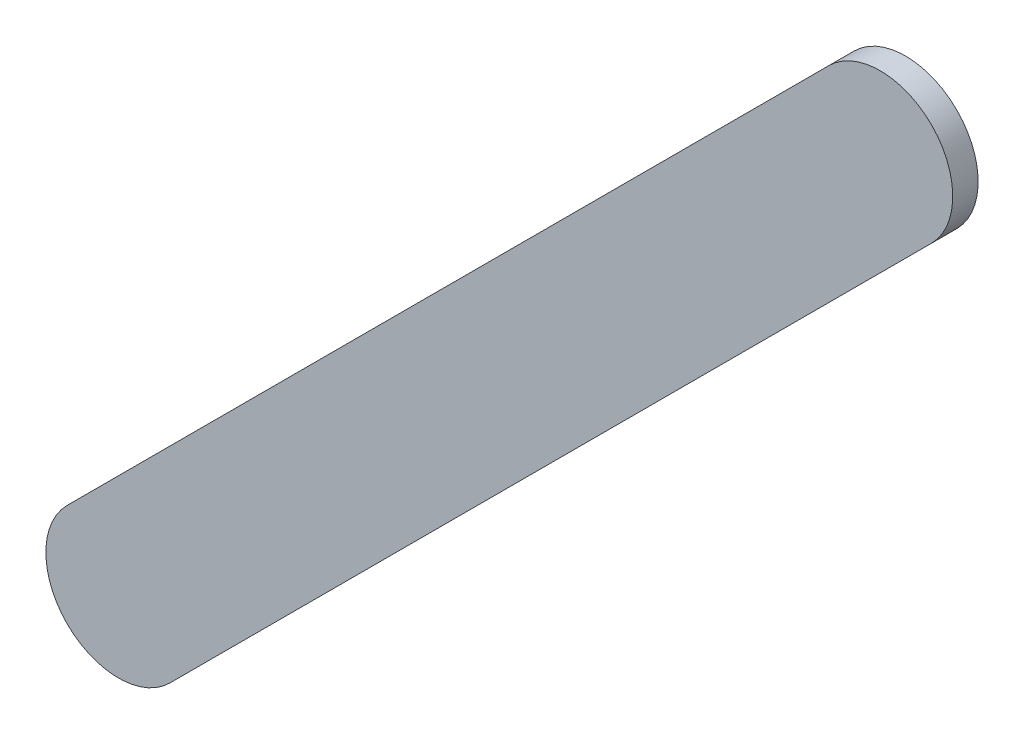
ISO-10303-21;
HEADER;
FILE_DESCRIPTION(('STEP AP214'),'2;1');
FILE_NAME('part.step','',(''),(''),'','','');
FILE_SCHEMA(('AUTOMOTIVE_DESIGN { 1 0 10303 214 1 1 1 1 }'));
ENDSEC;
DATA;
#1=APPLICATION_CONTEXT('core data for automotive mechanical design processes');
#2=APPLICATION_PROTOCOL_DEFINITION('international standard','automotive_design',2000,#1);
#3=PRODUCT_CONTEXT('',#1,'mechanical');
#4=PRODUCT('Part','Part','',(#3));
#5=PRODUCT_RELATED_PRODUCT_CATEGORY('part','',(#4));
#6=PRODUCT_DEFINITION_FORMATION('','',#4);
#7=PRODUCT_DEFINITION_CONTEXT('part definition',#1,'design');
#8=PRODUCT_DEFINITION('design','',#6,#7);
#9=PRODUCT_DEFINITION_SHAPE('','',#8);
#10=(LENGTH_UNIT() NAMED_UNIT(*) SI_UNIT(.MILLI.,.METRE.));
#11=(NAMED_UNIT(*) PLANE_ANGLE_UNIT() SI_UNIT($,.RADIAN.));
#12=(NAMED_UNIT(*) SI_UNIT($,.STERADIAN.) SOLID_ANGLE_UNIT());
#13=UNCERTAINTY_MEASURE_WITH_UNIT(LENGTH_MEASURE(1.E-05),#10,'distance_accuracy_value','');
#14=(GEOMETRIC_REPRESENTATION_CONTEXT(3) GLOBAL_UNCERTAINTY_ASSIGNED_CONTEXT((#13)) GLOBAL_UNIT_ASSIGNED_CONTEXT((#10,
#11,#12)) REPRESENTATION_CONTEXT('',''));
#15=CARTESIAN_POINT('',(0.,0.,0.));
#16=DIRECTION('',(0.,0.,1.));
#17=DIRECTION('',(1.,0.,0.));
#18=AXIS2_PLACEMENT_3D('',#15,#16,#17);
#19=CARTESIAN_POINT('',(76.67071,-135.52071,1.635));
#20=DIRECTION('',(0.,0.,1.));
#21=DIRECTION('',(1.,0.,0.));
#22=AXIS2_PLACEMENT_3D('',#19,#20,#21);
#23=PLANE('',#22);
#24=DIRECTION('',(0.707106781186548,0.707106781186548,0.));
#25=VECTOR('',#24,1.);
#26=CARTESIAN_POINT('',(76.67071,-135.52071,1.635));
#27=LINE('',#26,#25);
#28=CARTESIAN_POINT('',(76.67071,-135.52071,1.635));
#29=VERTEX_POINT('',#28);
#30=CARTESIAN_POINT('',(77.72071,-134.47071,1.635));
#31=VERTEX_POINT('',#30);
#32=EDGE_CURVE('E82',#29,#31,#27,.T.);
#33=ORIENTED_EDGE('',*,*,#32,.T.);
#34=CARTESIAN_POINT('',(77.6499995,-134.3999995,1.635));
#35=DIRECTION('',(0.,0.,1.));
#36=DIRECTION('',(0.707106781186048,-0.707106781187048,0.));
#37=AXIS2_PLACEMENT_3D('',#34,#35,#36);
#38=CIRCLE('',#37,0.09999974810218);
#39=CARTESIAN_POINT('',(77.579289,-134.329289,1.635));
#40=VERTEX_POINT('',#39);
#41=EDGE_CURVE('E104',#31,#40,#38,.T.);
#42=ORIENTED_EDGE('',*,*,#41,.T.);
#43=DIRECTION('',(-0.707106781186548,-0.707106781186548,0.));
#44=VECTOR('',#43,1.);
#45=CARTESIAN_POINT('',(77.579289,-134.329289,1.635));
#46=LINE('',#45,#44);
#47=CARTESIAN_POINT('',(76.529289,-135.379289,1.635));
#48=VERTEX_POINT('',#47);
#49=EDGE_CURVE('E75',#40,#48,#46,.T.);
#50=ORIENTED_EDGE('',*,*,#49,.T.);
#51=CARTESIAN_POINT('',(76.5999995,-135.4499995,1.635));
#52=DIRECTION('',(0.,0.,1.));
#53=DIRECTION('',(-0.707106781186548,0.707106781186548,0.));
#54=AXIS2_PLACEMENT_3D('',#51,#52,#53);
#55=CIRCLE('',#54,0.09999974810219);
#56=EDGE_CURVE('E11',#48,#29,#55,.T.);
#57=ORIENTED_EDGE('',*,*,#56,.T.);
#58=EDGE_LOOP('',(#33,#42,#50,#57));
#59=FACE_BOUND('',#58,.T.);
#60=ADVANCED_FACE('F17',(#59),#23,.T.);
#61=CARTESIAN_POINT('',(76.67071,-135.52071,1.6));
#62=DIRECTION('',(0.,0.,1.));
#63=DIRECTION('',(1.,0.,0.));
#64=AXIS2_PLACEMENT_3D('',#61,#62,#63);
#65=PLANE('',#64);
#66=CARTESIAN_POINT('',(76.5999995,-135.4499995,1.6));
#67=DIRECTION('',(0.,0.,1.));
#68=DIRECTION('',(-0.707106781186548,0.707106781186548,0.));
#69=AXIS2_PLACEMENT_3D('',#66,#67,#68);
#70=CIRCLE('',#69,0.09999974810219);
#71=CARTESIAN_POINT('',(76.529289,-135.379289,1.6));
#72=VERTEX_POINT('',#71);
#73=CARTESIAN_POINT('',(76.67071,-135.52071,1.6));
#74=VERTEX_POINT('',#73);
#75=EDGE_CURVE('E21',#72,#74,#70,.T.);
#76=ORIENTED_EDGE('',*,*,#75,.F.);
#77=DIRECTION('',(-0.707106781186548,-0.707106781186548,0.));
#78=VECTOR('',#77,1.);
#79=CARTESIAN_POINT('',(77.579289,-134.329289,1.6));
#80=LINE('',#79,#78);
#81=CARTESIAN_POINT('',(77.579289,-134.329289,1.6));
#82=VERTEX_POINT('',#81);
#83=EDGE_CURVE('E108',#82,#72,#80,.T.);
#84=ORIENTED_EDGE('',*,*,#83,.F.);
#85=CARTESIAN_POINT('',(77.6499995,-134.3999995,1.6));
#86=DIRECTION('',(0.,0.,1.));
#87=DIRECTION('',(0.707106781186048,-0.707106781187048,0.));
#88=AXIS2_PLACEMENT_3D('',#85,#86,#87);
#89=CIRCLE('',#88,0.09999974810218);
#90=CARTESIAN_POINT('',(77.72071,-134.47071,1.6));
#91=VERTEX_POINT('',#90);
#92=EDGE_CURVE('E84',#91,#82,#89,.T.);
#93=ORIENTED_EDGE('',*,*,#92,.F.);
#94=DIRECTION('',(0.707106781186548,0.707106781186548,0.));
#95=VECTOR('',#94,1.);
#96=CARTESIAN_POINT('',(76.67071,-135.52071,1.6));
#97=LINE('',#96,#95);
#98=EDGE_CURVE('E80',#74,#91,#97,.T.);
#99=ORIENTED_EDGE('',*,*,#98,.F.);
#100=EDGE_LOOP('',(#76,#84,#93,#99));
#101=FACE_BOUND('',#100,.T.);
#102=ADVANCED_FACE('F19',(#101),#65,.F.);
#103=CARTESIAN_POINT('',(76.5999995,-135.4499995,1.6));
#104=DIRECTION('',(0.,0.,-1.));
#105=DIRECTION('',(-0.707106781186548,0.707106781186548,0.));
#106=AXIS2_PLACEMENT_3D('',#103,#104,#105);
#107=CYLINDRICAL_SURFACE('',#106,0.09999974810219);
#108=ORIENTED_EDGE('',*,*,#75,.T.);
#109=DIRECTION('',(0.,0.,1.));
#110=VECTOR('',#109,1.);
#111=CARTESIAN_POINT('',(76.67071,-135.52071,1.6));
#112=LINE('',#111,#110);
#113=EDGE_CURVE('E69',#74,#29,#112,.T.);
#114=ORIENTED_EDGE('',*,*,#113,.T.);
#115=ORIENTED_EDGE('',*,*,#56,.F.);
#116=DIRECTION('',(0.,0.,1.));
#117=VECTOR('',#116,1.);
#118=CARTESIAN_POINT('',(76.529289,-135.379289,1.6));
#119=LINE('',#118,#117);
#120=EDGE_CURVE('E72',#72,#48,#119,.T.);
#121=ORIENTED_EDGE('',*,*,#120,.F.);
#122=EDGE_LOOP('',(#108,#114,#115,#121));
#123=FACE_BOUND('',#122,.T.);
#124=ADVANCED_FACE('F68',(#123),#107,.T.);
#125=CARTESIAN_POINT('',(77.579289,-134.329289,1.6));
#126=DIRECTION('',(0.707106781186548,-0.707106781186548,0.));
#127=DIRECTION('',(0.,0.,-1.));
#128=AXIS2_PLACEMENT_3D('',#125,#126,#127);
#129=PLANE('',#128);
#130=ORIENTED_EDGE('',*,*,#83,.T.);
#131=ORIENTED_EDGE('',*,*,#120,.T.);
#132=ORIENTED_EDGE('',*,*,#49,.F.);
#133=DIRECTION('',(0.,0.,1.));
#134=VECTOR('',#133,1.);
#135=CARTESIAN_POINT('',(77.579289,-134.329289,1.6));
#136=LINE('',#135,#134);
#137=EDGE_CURVE('E100',#82,#40,#136,.T.);
#138=ORIENTED_EDGE('',*,*,#137,.F.);
#139=EDGE_LOOP('',(#130,#131,#132,#138));
#140=FACE_BOUND('',#139,.T.);
#141=ADVANCED_FACE('F119',(#140),#129,.F.);
#142=CARTESIAN_POINT('',(77.6499995,-134.3999995,1.6));
#143=DIRECTION('',(0.,0.,-1.));
#144=DIRECTION('',(0.707106781186048,-0.707106781187048,0.));
#145=AXIS2_PLACEMENT_3D('',#142,#143,#144);
#146=CYLINDRICAL_SURFACE('',#145,0.09999974810218);
#147=ORIENTED_EDGE('',*,*,#92,.T.);
#148=ORIENTED_EDGE('',*,*,#137,.T.);
#149=ORIENTED_EDGE('',*,*,#41,.F.);
#150=DIRECTION('',(0.,0.,1.));
#151=VECTOR('',#150,1.);
#152=CARTESIAN_POINT('',(77.72071,-134.47071,1.6));
#153=LINE('',#152,#151);
#154=EDGE_CURVE('E89',#91,#31,#153,.T.);
#155=ORIENTED_EDGE('',*,*,#154,.F.);
#156=EDGE_LOOP('',(#147,#148,#149,#155));
#157=FACE_BOUND('',#156,.T.);
#158=ADVANCED_FACE('F121',(#157),#146,.T.);
#159=CARTESIAN_POINT('',(76.67071,-135.52071,1.6));
#160=DIRECTION('',(-0.707106781186548,0.707106781186548,0.));
#161=DIRECTION('',(0.,0.,1.));
#162=AXIS2_PLACEMENT_3D('',#159,#160,#161);
#163=PLANE('',#162);
#164=ORIENTED_EDGE('',*,*,#98,.T.);
#165=ORIENTED_EDGE('',*,*,#154,.T.);
#166=ORIENTED_EDGE('',*,*,#32,.F.);
#167=ORIENTED_EDGE('',*,*,#113,.F.);
#168=EDGE_LOOP('',(#164,#165,#166,#167));
#169=FACE_BOUND('',#168,.T.);
#170=ADVANCED_FACE('F78',(#169),#163,.F.);
#171=CLOSED_SHELL('',(#60,#102,#124,#141,#158,#170));
#172=MANIFOLD_SOLID_BREP('B1',#171);
#173=ADVANCED_BREP_SHAPE_REPRESENTATION('',(#18,#172),#14);
#174=SHAPE_DEFINITION_REPRESENTATION(#9,#173);
ENDSEC;
END-ISO-10303-21;
